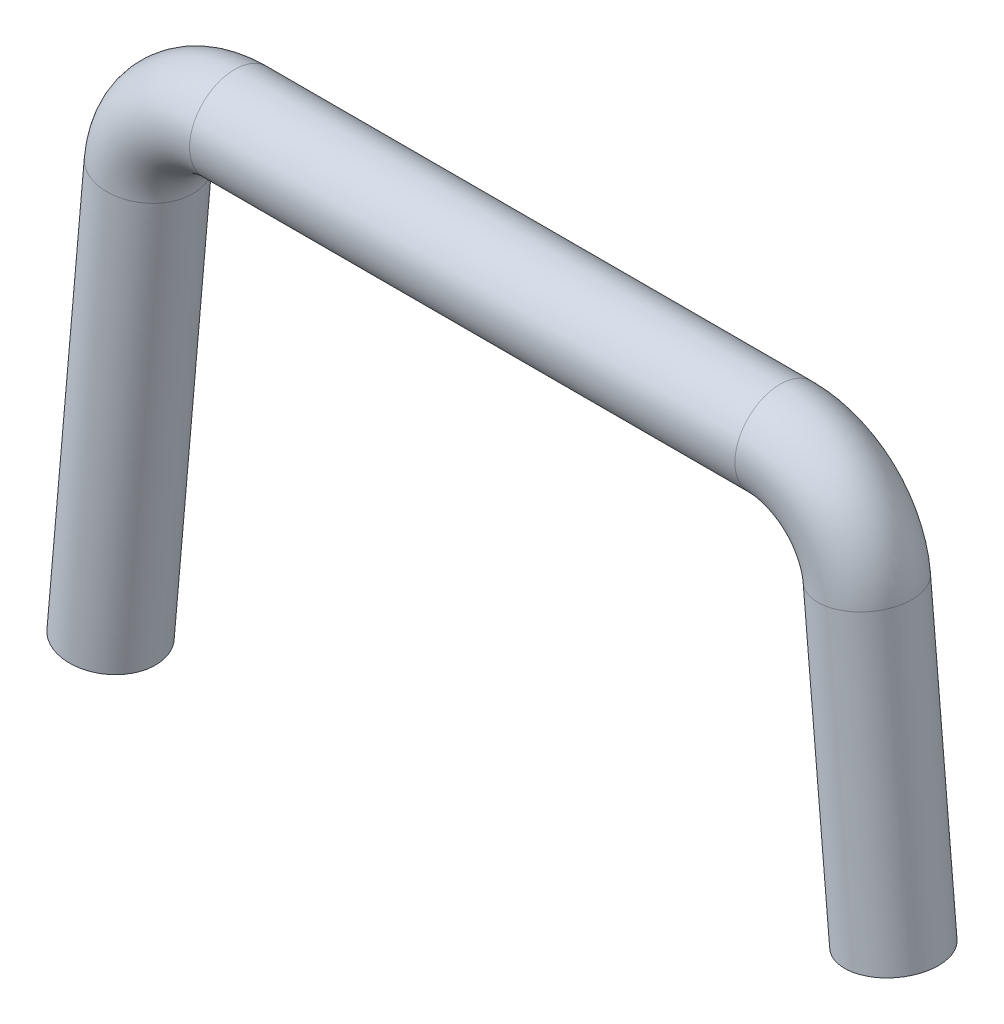
ISO-10303-21;
HEADER;
FILE_DESCRIPTION(('STEP AP214'),'2;1');
FILE_NAME('part.step','',(''),(''),'','','');
FILE_SCHEMA(('AUTOMOTIVE_DESIGN { 1 0 10303 214 1 1 1 1 }'));
ENDSEC;
DATA;
#1=APPLICATION_CONTEXT('core data for automotive mechanical design processes');
#2=APPLICATION_PROTOCOL_DEFINITION('international standard','automotive_design',2000,#1);
#3=PRODUCT_CONTEXT('',#1,'mechanical');
#4=PRODUCT('Part','Part','',(#3));
#5=PRODUCT_RELATED_PRODUCT_CATEGORY('part','',(#4));
#6=PRODUCT_DEFINITION_FORMATION('','',#4);
#7=PRODUCT_DEFINITION_CONTEXT('part definition',#1,'design');
#8=PRODUCT_DEFINITION('design','',#6,#7);
#9=PRODUCT_DEFINITION_SHAPE('','',#8);
#10=(LENGTH_UNIT() NAMED_UNIT(*) SI_UNIT(.MILLI.,.METRE.));
#11=(NAMED_UNIT(*) PLANE_ANGLE_UNIT() SI_UNIT($,.RADIAN.));
#12=(NAMED_UNIT(*) SI_UNIT($,.STERADIAN.) SOLID_ANGLE_UNIT());
#13=UNCERTAINTY_MEASURE_WITH_UNIT(LENGTH_MEASURE(1.E-05),#10,'distance_accuracy_value','');
#14=(GEOMETRIC_REPRESENTATION_CONTEXT(3) GLOBAL_UNCERTAINTY_ASSIGNED_CONTEXT((#13)) GLOBAL_UNIT_ASSIGNED_CONTEXT((#10,
#11,#12)) REPRESENTATION_CONTEXT('',''));
#15=CARTESIAN_POINT('',(0.,0.,0.));
#16=DIRECTION('',(0.,0.,1.));
#17=DIRECTION('',(1.,0.,0.));
#18=AXIS2_PLACEMENT_3D('',#15,#16,#17);
#19=CARTESIAN_POINT('',(0.,0.,0.));
#20=DIRECTION('',(0.0871557427476584,0.996194698091746,0.));
#21=DIRECTION('',(-0.996194698091746,0.0871557427476584,0.));
#22=AXIS2_PLACEMENT_3D('',#19,#20,#21);
#23=PLANE('',#22);
#24=CARTESIAN_POINT('',(0.,0.,0.));
#25=DIRECTION('',(0.0871557427476584,0.996194698091746,0.));
#26=DIRECTION('',(-0.996194698091746,0.0871557427476584,0.));
#27=AXIS2_PLACEMENT_3D('',#24,#25,#26);
#28=CIRCLE('',#27,7.);
#29=CARTESIAN_POINT('',(-6.97336288664222,0.610090199233609,0.));
#30=VERTEX_POINT('',#29);
#31=EDGE_CURVE('E47',#30,#30,#28,.T.);
#32=ORIENTED_EDGE('',*,*,#31,.F.);
#33=EDGE_LOOP('',(#32));
#34=FACE_BOUND('',#33,.T.);
#35=ADVANCED_FACE('F35',(#34),#23,.F.);
#36=CARTESIAN_POINT('',(121.35,19.1,0.));
#37=DIRECTION('',(0.0871557427476511,-0.996194698091746,0.));
#38=DIRECTION('',(0.996194698091746,0.0871557427476511,0.));
#39=AXIS2_PLACEMENT_3D('',#36,#37,#38);
#40=PLANE('',#39);
#41=CARTESIAN_POINT('',(121.35,19.1,0.));
#42=DIRECTION('',(0.0871557427476511,-0.996194698091746,0.));
#43=DIRECTION('',(0.996194698091746,0.0871557427476511,0.));
#44=AXIS2_PLACEMENT_3D('',#41,#42,#43);
#45=CIRCLE('',#44,7.);
#46=CARTESIAN_POINT('',(128.323362886642,19.7100901992336,0.));
#47=VERTEX_POINT('',#46);
#48=EDGE_CURVE('E11',#47,#47,#45,.T.);
#49=ORIENTED_EDGE('',*,*,#48,.T.);
#50=EDGE_LOOP('',(#49));
#51=FACE_BOUND('',#50,.T.);
#52=ADVANCED_FACE('F50',(#51),#40,.T.);
#53=CARTESIAN_POINT('',(0.,0.,0.));
#54=DIRECTION('',(0.0871557427476584,0.996194698091746,0.));
#55=DIRECTION('',(-0.996194698091746,0.0871557427476584,0.));
#56=AXIS2_PLACEMENT_3D('',#53,#54,#55);
#57=CYLINDRICAL_SURFACE('',#56,7.);
#58=CARTESIAN_POINT('',(5.7897025117817,66.1766025270934,0.));
#59=DIRECTION('',(0.0871557427476584,0.996194698091746,0.));
#60=DIRECTION('',(-0.996194698091746,0.0871557427476584,0.));
#61=AXIS2_PLACEMENT_3D('',#58,#59,#60);
#62=CIRCLE('',#61,7.);
#63=CARTESIAN_POINT('',(-1.18366037486051,66.786692726327,0.));
#64=VERTEX_POINT('',#63);
#65=EDGE_CURVE('E67',#64,#64,#62,.T.);
#66=ORIENTED_EDGE('',*,*,#65,.F.);
#67=EDGE_LOOP('',(#66));
#68=FACE_BOUND('',#67,.T.);
#69=ORIENTED_EDGE('',*,*,#31,.T.);
#70=EDGE_LOOP('',(#69));
#71=FACE_BOUND('',#70,.T.);
#72=ADVANCED_FACE('F71',(#68,#71),#57,.T.);
#73=CARTESIAN_POINT('',(19.2383309360203,65.,0.));
#74=DIRECTION('',(0.,0.,-1.));
#75=DIRECTION('',(-1.,0.,0.));
#76=AXIS2_PLACEMENT_3D('',#73,#74,#75);
#77=TOROIDAL_SURFACE('',#76,13.5,7.);
#78=CARTESIAN_POINT('',(19.2383309360203,78.5,0.));
#79=DIRECTION('',(1.,0.,0.));
#80=DIRECTION('',(0.,1.,0.));
#81=AXIS2_PLACEMENT_3D('',#78,#79,#80);
#82=CIRCLE('',#81,7.);
#83=CARTESIAN_POINT('',(19.2383309360203,85.5,0.));
#84=VERTEX_POINT('',#83);
#85=EDGE_CURVE('E62',#84,#84,#82,.T.);
#86=CARTESIAN_POINT('',(19.2383309360203,65.,0.));
#87=DIRECTION('',(0.,0.,-1.));
#88=DIRECTION('',(-1.,0.,0.));
#89=AXIS2_PLACEMENT_3D('',#86,#87,#88);
#90=CIRCLE('',#89,20.5);
#91=EDGE_CURVE('',#64,#84,#90,.T.);
#92=ORIENTED_EDGE('',*,*,#65,.T.);
#93=ORIENTED_EDGE('',*,*,#85,.F.);
#94=ORIENTED_EDGE('',*,*,#91,.T.);
#95=ORIENTED_EDGE('',*,*,#91,.F.);
#96=EDGE_LOOP('',(#92,#94,#93,#95));
#97=FACE_BOUND('',#96,.T.);
#98=ADVANCED_FACE('F73',(#97),#77,.T.);
#99=CARTESIAN_POINT('',(19.2383309360203,78.5,0.));
#100=DIRECTION('',(1.,0.,0.));
#101=DIRECTION('',(0.,1.,0.));
#102=AXIS2_PLACEMENT_3D('',#99,#100,#101);
#103=CYLINDRICAL_SURFACE('',#102,7.);
#104=CARTESIAN_POINT('',(103.782702537325,78.5,0.));
#105=DIRECTION('',(1.,0.,0.));
#106=DIRECTION('',(0.,1.,0.));
#107=AXIS2_PLACEMENT_3D('',#104,#105,#106);
#108=CIRCLE('',#107,7.);
#109=CARTESIAN_POINT('',(103.782702537325,85.5,0.));
#110=VERTEX_POINT('',#109);
#111=EDGE_CURVE('E60',#110,#110,#108,.T.);
#112=ORIENTED_EDGE('',*,*,#111,.F.);
#113=EDGE_LOOP('',(#112));
#114=FACE_BOUND('',#113,.T.);
#115=ORIENTED_EDGE('',*,*,#85,.T.);
#116=EDGE_LOOP('',(#115));
#117=FACE_BOUND('',#116,.T.);
#118=ADVANCED_FACE('F80',(#114,#117),#103,.T.);
#119=CARTESIAN_POINT('',(103.782702537325,65.,0.));
#120=DIRECTION('',(0.,0.,-1.));
#121=DIRECTION('',(-1.,0.,0.));
#122=AXIS2_PLACEMENT_3D('',#119,#120,#121);
#123=TOROIDAL_SURFACE('',#122,13.5,7.);
#124=CARTESIAN_POINT('',(117.231330961564,66.1766025270933,0.));
#125=DIRECTION('',(0.0871557427476508,-0.996194698091746,0.));
#126=DIRECTION('',(0.996194698091746,0.0871557427476508,0.));
#127=AXIS2_PLACEMENT_3D('',#124,#125,#126);
#128=CIRCLE('',#127,7.);
#129=CARTESIAN_POINT('',(124.204693848206,66.7866927263268,0.));
#130=VERTEX_POINT('',#129);
#131=EDGE_CURVE('E42',#130,#130,#128,.T.);
#132=CARTESIAN_POINT('',(103.782702537325,65.,0.));
#133=DIRECTION('',(0.,0.,-1.));
#134=DIRECTION('',(-1.,0.,0.));
#135=AXIS2_PLACEMENT_3D('',#132,#133,#134);
#136=CIRCLE('',#135,20.5);
#137=EDGE_CURVE('',#110,#130,#136,.T.);
#138=ORIENTED_EDGE('',*,*,#111,.T.);
#139=ORIENTED_EDGE('',*,*,#131,.F.);
#140=ORIENTED_EDGE('',*,*,#137,.T.);
#141=ORIENTED_EDGE('',*,*,#137,.F.);
#142=EDGE_LOOP('',(#138,#140,#139,#141));
#143=FACE_BOUND('',#142,.T.);
#144=ADVANCED_FACE('F55',(#143),#123,.T.);
#145=CARTESIAN_POINT('',(117.231330961564,66.1766025270933,0.));
#146=DIRECTION('',(0.0871557427476511,-0.996194698091746,0.));
#147=DIRECTION('',(0.996194698091746,0.0871557427476511,0.));
#148=AXIS2_PLACEMENT_3D('',#145,#146,#147);
#149=CYLINDRICAL_SURFACE('',#148,7.);
#150=ORIENTED_EDGE('',*,*,#48,.F.);
#151=EDGE_LOOP('',(#150));
#152=FACE_BOUND('',#151,.T.);
#153=ORIENTED_EDGE('',*,*,#131,.T.);
#154=EDGE_LOOP('',(#153));
#155=FACE_BOUND('',#154,.T.);
#156=ADVANCED_FACE('F52',(#152,#155),#149,.T.);
#157=CLOSED_SHELL('',(#35,#52,#72,#98,#118,#144,#156));
#158=MANIFOLD_SOLID_BREP('B2',#157);
#159=ADVANCED_BREP_SHAPE_REPRESENTATION('',(#18,#158),#14);
#160=SHAPE_DEFINITION_REPRESENTATION(#9,#159);
ENDSEC;
END-ISO-10303-21;
